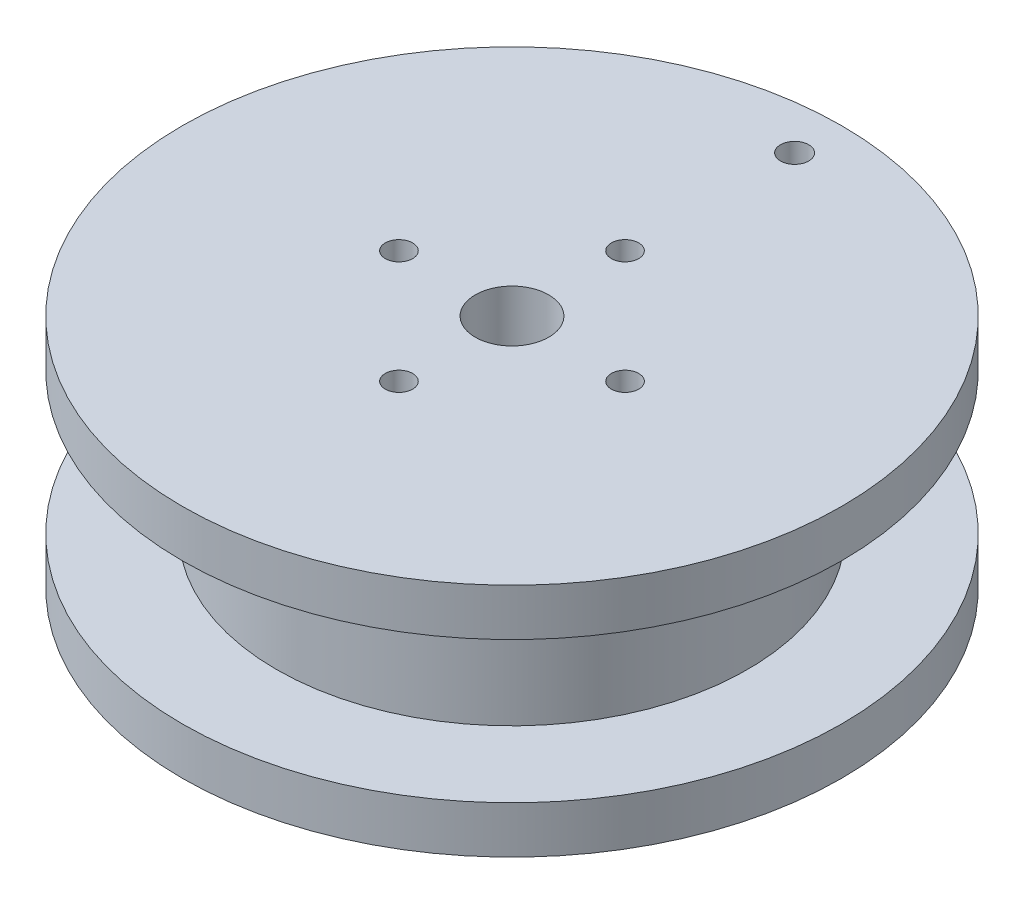
ISO-10303-21;
HEADER;
FILE_DESCRIPTION(('STEP AP214'),'2;1');
FILE_NAME('part.step','',(''),(''),'','','');
FILE_SCHEMA(('AUTOMOTIVE_DESIGN { 1 0 10303 214 1 1 1 1 }'));
ENDSEC;
DATA;
#1=APPLICATION_CONTEXT('core data for automotive mechanical design processes');
#2=APPLICATION_PROTOCOL_DEFINITION('international standard','automotive_design',2000,#1);
#3=PRODUCT_CONTEXT('',#1,'mechanical');
#4=PRODUCT('Part','Part','',(#3));
#5=PRODUCT_RELATED_PRODUCT_CATEGORY('part','',(#4));
#6=PRODUCT_DEFINITION_FORMATION('','',#4);
#7=PRODUCT_DEFINITION_CONTEXT('part definition',#1,'design');
#8=PRODUCT_DEFINITION('design','',#6,#7);
#9=PRODUCT_DEFINITION_SHAPE('','',#8);
#10=(LENGTH_UNIT() NAMED_UNIT(*) SI_UNIT(.MILLI.,.METRE.));
#11=(NAMED_UNIT(*) PLANE_ANGLE_UNIT() SI_UNIT($,.RADIAN.));
#12=(NAMED_UNIT(*) SI_UNIT($,.STERADIAN.) SOLID_ANGLE_UNIT());
#13=UNCERTAINTY_MEASURE_WITH_UNIT(LENGTH_MEASURE(1.E-05),#10,'distance_accuracy_value','');
#14=(GEOMETRIC_REPRESENTATION_CONTEXT(3) GLOBAL_UNCERTAINTY_ASSIGNED_CONTEXT((#13)) GLOBAL_UNIT_ASSIGNED_CONTEXT((#10,
#11,#12)) REPRESENTATION_CONTEXT('',''));
#15=CARTESIAN_POINT('',(0.,0.,0.));
#16=DIRECTION('',(0.,0.,1.));
#17=DIRECTION('',(1.,0.,0.));
#18=AXIS2_PLACEMENT_3D('',#15,#16,#17);
#19=CARTESIAN_POINT('',(0.,15.,0.));
#20=DIRECTION('',(0.,-1.,0.));
#21=DIRECTION('',(0.,0.,-1.));
#22=AXIS2_PLACEMENT_3D('',#19,#20,#21);
#23=PLANE('',#22);
#24=CARTESIAN_POINT('',(0.,15.,-30.));
#25=DIRECTION('',(0.,-1.,0.));
#26=DIRECTION('',(0.,0.,-1.));
#27=AXIS2_PLACEMENT_3D('',#24,#25,#26);
#28=CIRCLE('',#27,1.5);
#29=CARTESIAN_POINT('',(0.,15.,-31.5));
#30=VERTEX_POINT('',#29);
#31=EDGE_CURVE('E135',#30,#30,#28,.T.);
#32=ORIENTED_EDGE('',*,*,#31,.F.);
#33=EDGE_LOOP('',(#32));
#34=FACE_BOUND('',#33,.T.);
#35=CARTESIAN_POINT('',(0.,15.,0.));
#36=DIRECTION('',(0.,-1.,0.));
#37=DIRECTION('',(0.,0.,-1.));
#38=AXIS2_PLACEMENT_3D('',#35,#36,#37);
#39=CIRCLE('',#38,35.);
#40=CARTESIAN_POINT('',(0.,15.,-35.));
#41=VERTEX_POINT('',#40);
#42=EDGE_CURVE('E10',#41,#41,#39,.T.);
#43=ORIENTED_EDGE('',*,*,#42,.T.);
#44=EDGE_LOOP('',(#43));
#45=FACE_BOUND('',#44,.T.);
#46=CARTESIAN_POINT('',(0.,15.,0.));
#47=DIRECTION('',(0.,-1.,0.));
#48=DIRECTION('',(0.,0.,-1.));
#49=AXIS2_PLACEMENT_3D('',#46,#47,#48);
#50=CIRCLE('',#49,25.);
#51=CARTESIAN_POINT('',(0.,15.,-25.));
#52=VERTEX_POINT('',#51);
#53=EDGE_CURVE('E76',#52,#52,#50,.T.);
#54=ORIENTED_EDGE('',*,*,#53,.F.);
#55=EDGE_LOOP('',(#54));
#56=FACE_BOUND('',#55,.T.);
#57=ADVANCED_FACE('F39',(#34,#45,#56),#23,.T.);
#58=CARTESIAN_POINT('',(0.,0.,0.));
#59=DIRECTION('',(0.,-1.,0.));
#60=DIRECTION('',(0.,0.,-1.));
#61=AXIS2_PLACEMENT_3D('',#58,#59,#60);
#62=CYLINDRICAL_SURFACE('',#61,35.);
#63=CARTESIAN_POINT('',(0.,20.,0.));
#64=DIRECTION('',(0.,-1.,0.));
#65=DIRECTION('',(0.,0.,-1.));
#66=AXIS2_PLACEMENT_3D('',#63,#64,#65);
#67=CIRCLE('',#66,35.);
#68=CARTESIAN_POINT('',(0.,20.,-35.));
#69=VERTEX_POINT('',#68);
#70=EDGE_CURVE('E47',#69,#69,#67,.T.);
#71=ORIENTED_EDGE('',*,*,#70,.T.);
#72=EDGE_LOOP('',(#71));
#73=FACE_BOUND('',#72,.T.);
#74=ORIENTED_EDGE('',*,*,#42,.F.);
#75=EDGE_LOOP('',(#74));
#76=FACE_BOUND('',#75,.T.);
#77=ADVANCED_FACE('F126',(#73,#76),#62,.T.);
#78=CARTESIAN_POINT('',(0.,20.,0.));
#79=DIRECTION('',(0.,-1.,0.));
#80=DIRECTION('',(0.,0.,-1.));
#81=AXIS2_PLACEMENT_3D('',#78,#79,#80);
#82=PLANE('',#81);
#83=CARTESIAN_POINT('',(0.,20.,-30.));
#84=DIRECTION('',(0.,1.,0.));
#85=DIRECTION('',(0.,0.,1.));
#86=AXIS2_PLACEMENT_3D('',#83,#84,#85);
#87=CIRCLE('',#86,1.5);
#88=CARTESIAN_POINT('',(0.,20.,-28.5));
#89=VERTEX_POINT('',#88);
#90=EDGE_CURVE('E181',#89,#89,#87,.T.);
#91=ORIENTED_EDGE('',*,*,#90,.F.);
#92=EDGE_LOOP('',(#91));
#93=FACE_BOUND('',#92,.T.);
#94=CARTESIAN_POINT('',(0.,20.,-12.));
#95=DIRECTION('',(0.,1.,0.));
#96=DIRECTION('',(0.,0.,1.));
#97=AXIS2_PLACEMENT_3D('',#94,#95,#96);
#98=CIRCLE('',#97,1.45);
#99=CARTESIAN_POINT('',(0.,20.,-10.55));
#100=VERTEX_POINT('',#99);
#101=EDGE_CURVE('E62',#100,#100,#98,.T.);
#102=ORIENTED_EDGE('',*,*,#101,.F.);
#103=EDGE_LOOP('',(#102));
#104=FACE_BOUND('',#103,.T.);
#105=CARTESIAN_POINT('',(0.,20.,0.));
#106=DIRECTION('',(0.,1.,0.));
#107=DIRECTION('',(0.,0.,1.));
#108=AXIS2_PLACEMENT_3D('',#105,#106,#107);
#109=CIRCLE('',#108,3.9);
#110=CARTESIAN_POINT('',(0.,20.,3.9));
#111=VERTEX_POINT('',#110);
#112=EDGE_CURVE('E139',#111,#111,#109,.T.);
#113=ORIENTED_EDGE('',*,*,#112,.F.);
#114=EDGE_LOOP('',(#113));
#115=FACE_BOUND('',#114,.T.);
#116=CARTESIAN_POINT('',(-11.9999999999997,20.,3.4032572508536E-13));
#117=DIRECTION('',(0.,1.,0.));
#118=DIRECTION('',(0.,0.,1.));
#119=AXIS2_PLACEMENT_3D('',#116,#117,#118);
#120=CIRCLE('',#119,1.45000000000054);
#121=CARTESIAN_POINT('',(-11.9999999999997,20.,1.45000000000088));
#122=VERTEX_POINT('',#121);
#123=EDGE_CURVE('E145',#122,#122,#120,.T.);
#124=ORIENTED_EDGE('',*,*,#123,.F.);
#125=EDGE_LOOP('',(#124));
#126=FACE_BOUND('',#125,.T.);
#127=CARTESIAN_POINT('',(6.77712297852766E-13,20.,12.));
#128=DIRECTION('',(0.,1.,0.));
#129=DIRECTION('',(0.,0.,1.));
#130=AXIS2_PLACEMENT_3D('',#127,#128,#129);
#131=CIRCLE('',#130,1.45000000000073);
#132=CARTESIAN_POINT('',(6.77712297852766E-13,20.,13.4500000000007));
#133=VERTEX_POINT('',#132);
#134=EDGE_CURVE('E90',#133,#133,#131,.T.);
#135=ORIENTED_EDGE('',*,*,#134,.F.);
#136=EDGE_LOOP('',(#135));
#137=FACE_BOUND('',#136,.T.);
#138=CARTESIAN_POINT('',(12.0000000000003,20.,-3.38856148926383E-13));
#139=DIRECTION('',(0.,1.,0.));
#140=DIRECTION('',(0.,0.,1.));
#141=AXIS2_PLACEMENT_3D('',#138,#139,#140);
#142=CIRCLE('',#141,1.45000000000027);
#143=CARTESIAN_POINT('',(12.0000000000003,20.,1.44999999999993));
#144=VERTEX_POINT('',#143);
#145=EDGE_CURVE('E154',#144,#144,#142,.T.);
#146=ORIENTED_EDGE('',*,*,#145,.F.);
#147=EDGE_LOOP('',(#146));
#148=FACE_BOUND('',#147,.T.);
#149=ORIENTED_EDGE('',*,*,#70,.F.);
#150=EDGE_LOOP('',(#149));
#151=FACE_BOUND('',#150,.T.);
#152=ADVANCED_FACE('F131',(#93,#104,#115,#126,#137,#148,#151),#82,.F.);
#153=CARTESIAN_POINT('',(0.,-5.,0.));
#154=DIRECTION('',(0.,-1.,0.));
#155=DIRECTION('',(0.,0.,-1.));
#156=AXIS2_PLACEMENT_3D('',#153,#154,#155);
#157=PLANE('',#156);
#158=CARTESIAN_POINT('',(0.,-5.,-30.));
#159=DIRECTION('',(0.,-1.,0.));
#160=DIRECTION('',(0.,0.,-1.));
#161=AXIS2_PLACEMENT_3D('',#158,#159,#160);
#162=CIRCLE('',#161,1.5);
#163=CARTESIAN_POINT('',(0.,-5.,-31.5));
#164=VERTEX_POINT('',#163);
#165=EDGE_CURVE('E140',#164,#164,#162,.T.);
#166=ORIENTED_EDGE('',*,*,#165,.F.);
#167=EDGE_LOOP('',(#166));
#168=FACE_BOUND('',#167,.T.);
#169=CARTESIAN_POINT('',(0.,-5.,-12.));
#170=DIRECTION('',(0.,-1.,0.));
#171=DIRECTION('',(0.,0.,-1.));
#172=AXIS2_PLACEMENT_3D('',#169,#170,#171);
#173=CIRCLE('',#172,1.45);
#174=CARTESIAN_POINT('',(0.,-5.,-13.45));
#175=VERTEX_POINT('',#174);
#176=EDGE_CURVE('E73',#175,#175,#173,.T.);
#177=ORIENTED_EDGE('',*,*,#176,.F.);
#178=EDGE_LOOP('',(#177));
#179=FACE_BOUND('',#178,.T.);
#180=CARTESIAN_POINT('',(0.,-5.,0.));
#181=DIRECTION('',(0.,-1.,0.));
#182=DIRECTION('',(0.,0.,-1.));
#183=AXIS2_PLACEMENT_3D('',#180,#181,#182);
#184=CIRCLE('',#183,3.9);
#185=CARTESIAN_POINT('',(0.,-5.,-3.9));
#186=VERTEX_POINT('',#185);
#187=EDGE_CURVE('E70',#186,#186,#184,.T.);
#188=ORIENTED_EDGE('',*,*,#187,.F.);
#189=EDGE_LOOP('',(#188));
#190=FACE_BOUND('',#189,.T.);
#191=CARTESIAN_POINT('',(-11.9999999999997,-5.,3.4032572508536E-13));
#192=DIRECTION('',(0.,-1.,0.));
#193=DIRECTION('',(0.,0.,-1.));
#194=AXIS2_PLACEMENT_3D('',#191,#192,#193);
#195=CIRCLE('',#194,1.45000000000054);
#196=CARTESIAN_POINT('',(-11.9999999999997,-5.,-1.4500000000002));
#197=VERTEX_POINT('',#196);
#198=EDGE_CURVE('E66',#197,#197,#195,.T.);
#199=ORIENTED_EDGE('',*,*,#198,.F.);
#200=EDGE_LOOP('',(#199));
#201=FACE_BOUND('',#200,.T.);
#202=CARTESIAN_POINT('',(6.77712297852766E-13,-5.,12.));
#203=DIRECTION('',(0.,-1.,0.));
#204=DIRECTION('',(0.,0.,-1.));
#205=AXIS2_PLACEMENT_3D('',#202,#203,#204);
#206=CIRCLE('',#205,1.45000000000073);
#207=CARTESIAN_POINT('',(6.77712297852766E-13,-5.,10.5499999999993));
#208=VERTEX_POINT('',#207);
#209=EDGE_CURVE('E61',#208,#208,#206,.T.);
#210=ORIENTED_EDGE('',*,*,#209,.F.);
#211=EDGE_LOOP('',(#210));
#212=FACE_BOUND('',#211,.T.);
#213=CARTESIAN_POINT('',(12.0000000000003,-5.,-3.38856148926383E-13));
#214=DIRECTION('',(0.,-1.,0.));
#215=DIRECTION('',(0.,0.,-1.));
#216=AXIS2_PLACEMENT_3D('',#213,#214,#215);
#217=CIRCLE('',#216,1.45000000000027);
#218=CARTESIAN_POINT('',(12.0000000000003,-5.,-1.4500000000006));
#219=VERTEX_POINT('',#218);
#220=EDGE_CURVE('E57',#219,#219,#217,.T.);
#221=ORIENTED_EDGE('',*,*,#220,.F.);
#222=EDGE_LOOP('',(#221));
#223=FACE_BOUND('',#222,.T.);
#224=CARTESIAN_POINT('',(0.,-5.,0.));
#225=DIRECTION('',(0.,-1.,0.));
#226=DIRECTION('',(0.,0.,-1.));
#227=AXIS2_PLACEMENT_3D('',#224,#225,#226);
#228=CIRCLE('',#227,35.);
#229=CARTESIAN_POINT('',(0.,-5.,-35.));
#230=VERTEX_POINT('',#229);
#231=EDGE_CURVE('E53',#230,#230,#228,.T.);
#232=ORIENTED_EDGE('',*,*,#231,.T.);
#233=EDGE_LOOP('',(#232));
#234=FACE_BOUND('',#233,.T.);
#235=ADVANCED_FACE('F99',(#168,#179,#190,#201,#212,#223,#234),#157,.T.);
#236=CARTESIAN_POINT('',(0.,0.,0.));
#237=DIRECTION('',(0.,-1.,0.));
#238=DIRECTION('',(0.,0.,-1.));
#239=AXIS2_PLACEMENT_3D('',#236,#237,#238);
#240=CYLINDRICAL_SURFACE('',#239,35.);
#241=ORIENTED_EDGE('',*,*,#231,.F.);
#242=EDGE_LOOP('',(#241));
#243=FACE_BOUND('',#242,.T.);
#244=CARTESIAN_POINT('',(0.,0.,0.));
#245=DIRECTION('',(0.,-1.,0.));
#246=DIRECTION('',(0.,0.,-1.));
#247=AXIS2_PLACEMENT_3D('',#244,#245,#246);
#248=CIRCLE('',#247,35.);
#249=CARTESIAN_POINT('',(0.,0.,-35.));
#250=VERTEX_POINT('',#249);
#251=EDGE_CURVE('E87',#250,#250,#248,.T.);
#252=ORIENTED_EDGE('',*,*,#251,.T.);
#253=EDGE_LOOP('',(#252));
#254=FACE_BOUND('',#253,.T.);
#255=ADVANCED_FACE('F101',(#243,#254),#240,.T.);
#256=CARTESIAN_POINT('',(0.,0.,0.));
#257=DIRECTION('',(0.,-1.,0.));
#258=DIRECTION('',(0.,0.,-1.));
#259=AXIS2_PLACEMENT_3D('',#256,#257,#258);
#260=PLANE('',#259);
#261=CARTESIAN_POINT('',(0.,0.,-30.));
#262=DIRECTION('',(0.,-1.,0.));
#263=DIRECTION('',(0.,0.,-1.));
#264=AXIS2_PLACEMENT_3D('',#261,#262,#263);
#265=CIRCLE('',#264,1.5);
#266=CARTESIAN_POINT('',(0.,0.,-31.5));
#267=VERTEX_POINT('',#266);
#268=EDGE_CURVE('E42',#267,#267,#265,.T.);
#269=ORIENTED_EDGE('',*,*,#268,.T.);
#270=EDGE_LOOP('',(#269));
#271=FACE_BOUND('',#270,.T.);
#272=ORIENTED_EDGE('',*,*,#251,.F.);
#273=EDGE_LOOP('',(#272));
#274=FACE_BOUND('',#273,.T.);
#275=CARTESIAN_POINT('',(0.,0.,0.));
#276=DIRECTION('',(0.,-1.,0.));
#277=DIRECTION('',(0.,0.,-1.));
#278=AXIS2_PLACEMENT_3D('',#275,#276,#277);
#279=CIRCLE('',#278,25.);
#280=CARTESIAN_POINT('',(0.,0.,-25.));
#281=VERTEX_POINT('',#280);
#282=EDGE_CURVE('E81',#281,#281,#279,.T.);
#283=ORIENTED_EDGE('',*,*,#282,.T.);
#284=EDGE_LOOP('',(#283));
#285=FACE_BOUND('',#284,.T.);
#286=ADVANCED_FACE('F104',(#271,#274,#285),#260,.F.);
#287=CARTESIAN_POINT('',(0.,0.,0.));
#288=DIRECTION('',(0.,-1.,0.));
#289=DIRECTION('',(0.,0.,-1.));
#290=AXIS2_PLACEMENT_3D('',#287,#288,#289);
#291=CYLINDRICAL_SURFACE('',#290,25.);
#292=ORIENTED_EDGE('',*,*,#53,.T.);
#293=EDGE_LOOP('',(#292));
#294=FACE_BOUND('',#293,.T.);
#295=ORIENTED_EDGE('',*,*,#282,.F.);
#296=EDGE_LOOP('',(#295));
#297=FACE_BOUND('',#296,.T.);
#298=ADVANCED_FACE('F110',(#294,#297),#291,.T.);
#299=CARTESIAN_POINT('',(12.0000000000003,-33.,-3.38856148926383E-13));
#300=DIRECTION('',(0.,1.,0.));
#301=DIRECTION('',(0.,0.,1.));
#302=AXIS2_PLACEMENT_3D('',#299,#300,#301);
#303=CYLINDRICAL_SURFACE('',#302,1.45000000000027);
#304=ORIENTED_EDGE('',*,*,#220,.T.);
#305=EDGE_LOOP('',(#304));
#306=FACE_BOUND('',#305,.T.);
#307=ORIENTED_EDGE('',*,*,#145,.T.);
#308=EDGE_LOOP('',(#307));
#309=FACE_BOUND('',#308,.T.);
#310=ADVANCED_FACE('F116',(#306,#309),#303,.F.);
#311=CARTESIAN_POINT('',(6.77712297852766E-13,-33.,12.));
#312=DIRECTION('',(0.,1.,0.));
#313=DIRECTION('',(0.,0.,1.));
#314=AXIS2_PLACEMENT_3D('',#311,#312,#313);
#315=CYLINDRICAL_SURFACE('',#314,1.45000000000073);
#316=ORIENTED_EDGE('',*,*,#209,.T.);
#317=EDGE_LOOP('',(#316));
#318=FACE_BOUND('',#317,.T.);
#319=ORIENTED_EDGE('',*,*,#134,.T.);
#320=EDGE_LOOP('',(#319));
#321=FACE_BOUND('',#320,.T.);
#322=ADVANCED_FACE('F121',(#318,#321),#315,.F.);
#323=CARTESIAN_POINT('',(-11.9999999999997,-33.,3.4032572508536E-13));
#324=DIRECTION('',(0.,1.,0.));
#325=DIRECTION('',(0.,0.,1.));
#326=AXIS2_PLACEMENT_3D('',#323,#324,#325);
#327=CYLINDRICAL_SURFACE('',#326,1.45000000000054);
#328=ORIENTED_EDGE('',*,*,#198,.T.);
#329=EDGE_LOOP('',(#328));
#330=FACE_BOUND('',#329,.T.);
#331=ORIENTED_EDGE('',*,*,#123,.T.);
#332=EDGE_LOOP('',(#331));
#333=FACE_BOUND('',#332,.T.);
#334=ADVANCED_FACE('F188',(#330,#333),#327,.F.);
#335=CARTESIAN_POINT('',(0.,-33.,0.));
#336=DIRECTION('',(0.,1.,0.));
#337=DIRECTION('',(0.,0.,1.));
#338=AXIS2_PLACEMENT_3D('',#335,#336,#337);
#339=CYLINDRICAL_SURFACE('',#338,3.9);
#340=ORIENTED_EDGE('',*,*,#187,.T.);
#341=EDGE_LOOP('',(#340));
#342=FACE_BOUND('',#341,.T.);
#343=ORIENTED_EDGE('',*,*,#112,.T.);
#344=EDGE_LOOP('',(#343));
#345=FACE_BOUND('',#344,.T.);
#346=ADVANCED_FACE('F190',(#342,#345),#339,.F.);
#347=CARTESIAN_POINT('',(0.,-33.,-12.));
#348=DIRECTION('',(0.,1.,0.));
#349=DIRECTION('',(0.,0.,1.));
#350=AXIS2_PLACEMENT_3D('',#347,#348,#349);
#351=CYLINDRICAL_SURFACE('',#350,1.45);
#352=ORIENTED_EDGE('',*,*,#176,.T.);
#353=EDGE_LOOP('',(#352));
#354=FACE_BOUND('',#353,.T.);
#355=ORIENTED_EDGE('',*,*,#101,.T.);
#356=EDGE_LOOP('',(#355));
#357=FACE_BOUND('',#356,.T.);
#358=ADVANCED_FACE('F197',(#354,#357),#351,.F.);
#359=CARTESIAN_POINT('',(0.,-33.,-30.));
#360=DIRECTION('',(0.,1.,0.));
#361=DIRECTION('',(0.,0.,1.));
#362=AXIS2_PLACEMENT_3D('',#359,#360,#361);
#363=CYLINDRICAL_SURFACE('',#362,1.5);
#364=ORIENTED_EDGE('',*,*,#165,.T.);
#365=EDGE_LOOP('',(#364));
#366=FACE_BOUND('',#365,.T.);
#367=ORIENTED_EDGE('',*,*,#268,.F.);
#368=EDGE_LOOP('',(#367));
#369=FACE_BOUND('',#368,.T.);
#370=ADVANCED_FACE('F204',(#366,#369),#363,.F.);
#371=ORIENTED_EDGE('',*,*,#31,.T.);
#372=EDGE_LOOP('',(#371));
#373=FACE_BOUND('',#372,.T.);
#374=ORIENTED_EDGE('',*,*,#90,.T.);
#375=EDGE_LOOP('',(#374));
#376=FACE_BOUND('',#375,.T.);
#377=ADVANCED_FACE('F205',(#373,#376),#363,.F.);
#378=CLOSED_SHELL('',(#57,#77,#152,#235,#255,#286,#298,#310,#322,#334,#346,#358,#370,#377));
#379=MANIFOLD_SOLID_BREP('B2',#378);
#380=ADVANCED_BREP_SHAPE_REPRESENTATION('',(#18,#379),#14);
#381=SHAPE_DEFINITION_REPRESENTATION(#9,#380);
ENDSEC;
END-ISO-10303-21;
